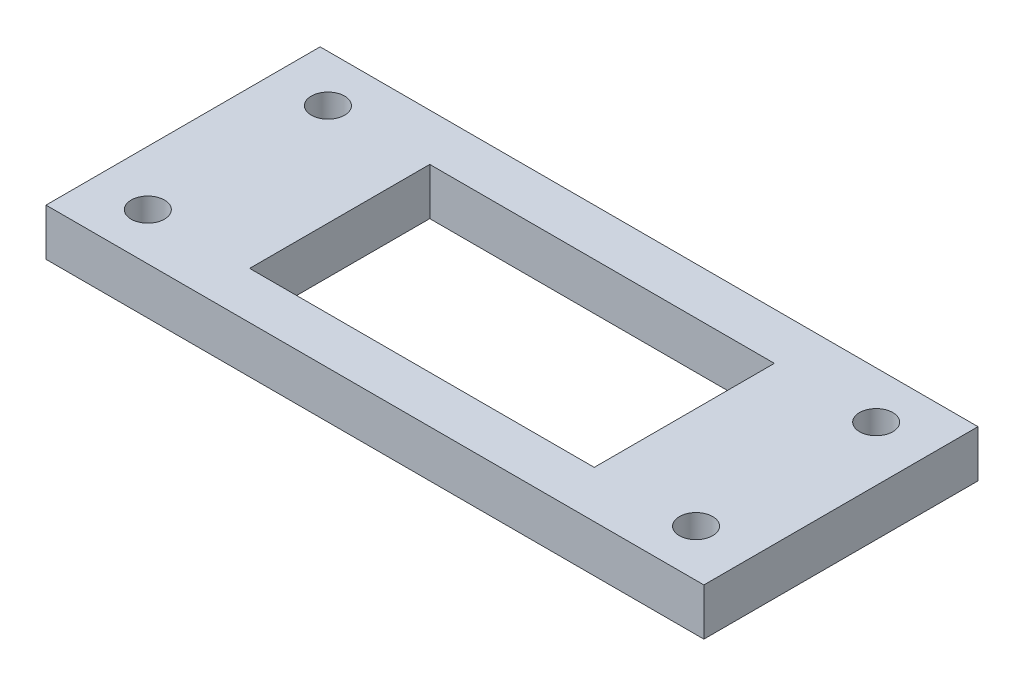
ISO-10303-21;
HEADER;
FILE_DESCRIPTION(('STEP AP214'),'2;1');
FILE_NAME('part.step','',(''),(''),'','','');
FILE_SCHEMA(('AUTOMOTIVE_DESIGN { 1 0 10303 214 1 1 1 1 }'));
ENDSEC;
DATA;
#1=APPLICATION_CONTEXT('core data for automotive mechanical design processes');
#2=APPLICATION_PROTOCOL_DEFINITION('international standard','automotive_design',2000,#1);
#3=PRODUCT_CONTEXT('',#1,'mechanical');
#4=PRODUCT('Part','Part','',(#3));
#5=PRODUCT_RELATED_PRODUCT_CATEGORY('part','',(#4));
#6=PRODUCT_DEFINITION_FORMATION('','',#4);
#7=PRODUCT_DEFINITION_CONTEXT('part definition',#1,'design');
#8=PRODUCT_DEFINITION('design','',#6,#7);
#9=PRODUCT_DEFINITION_SHAPE('','',#8);
#10=(LENGTH_UNIT() NAMED_UNIT(*) SI_UNIT(.MILLI.,.METRE.));
#11=(NAMED_UNIT(*) PLANE_ANGLE_UNIT() SI_UNIT($,.RADIAN.));
#12=(NAMED_UNIT(*) SI_UNIT($,.STERADIAN.) SOLID_ANGLE_UNIT());
#13=UNCERTAINTY_MEASURE_WITH_UNIT(LENGTH_MEASURE(1.E-05),#10,'distance_accuracy_value','');
#14=(GEOMETRIC_REPRESENTATION_CONTEXT(3) GLOBAL_UNCERTAINTY_ASSIGNED_CONTEXT((#13)) GLOBAL_UNIT_ASSIGNED_CONTEXT((#10,
#11,#12)) REPRESENTATION_CONTEXT('',''));
#15=CARTESIAN_POINT('',(0.,0.,0.));
#16=DIRECTION('',(0.,0.,1.));
#17=DIRECTION('',(1.,0.,0.));
#18=AXIS2_PLACEMENT_3D('',#15,#16,#17);
#19=CARTESIAN_POINT('',(0.,12.,0.));
#20=DIRECTION('',(0.,-1.,0.));
#21=DIRECTION('',(0.,0.,-1.));
#22=AXIS2_PLACEMENT_3D('',#19,#20,#21);
#23=PLANE('',#22);
#24=DIRECTION('',(0.,0.,1.));
#25=VECTOR('',#24,1.);
#26=CARTESIAN_POINT('',(-84.,12.,35.));
#27=LINE('',#26,#25);
#28=CARTESIAN_POINT('',(-84.,12.,-35.));
#29=VERTEX_POINT('',#28);
#30=CARTESIAN_POINT('',(-84.,12.,35.));
#31=VERTEX_POINT('',#30);
#32=EDGE_CURVE('E142',#29,#31,#27,.T.);
#33=ORIENTED_EDGE('',*,*,#32,.T.);
#34=DIRECTION('',(1.,0.,0.));
#35=VECTOR('',#34,1.);
#36=CARTESIAN_POINT('',(-84.,12.,35.));
#37=LINE('',#36,#35);
#38=CARTESIAN_POINT('',(84.,12.,35.));
#39=VERTEX_POINT('',#38);
#40=EDGE_CURVE('E147',#31,#39,#37,.T.);
#41=ORIENTED_EDGE('',*,*,#40,.T.);
#42=DIRECTION('',(0.,0.,-1.));
#43=VECTOR('',#42,1.);
#44=CARTESIAN_POINT('',(84.,12.,35.));
#45=LINE('',#44,#43);
#46=CARTESIAN_POINT('',(84.,12.,-35.));
#47=VERTEX_POINT('',#46);
#48=EDGE_CURVE('E146',#39,#47,#45,.T.);
#49=ORIENTED_EDGE('',*,*,#48,.T.);
#50=DIRECTION('',(-1.,0.,0.));
#51=VECTOR('',#50,1.);
#52=CARTESIAN_POINT('',(-84.,12.,-35.));
#53=LINE('',#52,#51);
#54=EDGE_CURVE('E151',#47,#29,#53,.T.);
#55=ORIENTED_EDGE('',*,*,#54,.T.);
#56=EDGE_LOOP('',(#33,#41,#49,#55));
#57=FACE_BOUND('',#56,.T.);
#58=DIRECTION('',(0.,0.,1.));
#59=VECTOR('',#58,1.);
#60=CARTESIAN_POINT('',(-44.,12.,23.));
#61=LINE('',#60,#59);
#62=CARTESIAN_POINT('',(-44.,12.,-23.));
#63=VERTEX_POINT('',#62);
#64=CARTESIAN_POINT('',(-44.,12.,23.));
#65=VERTEX_POINT('',#64);
#66=EDGE_CURVE('E101',#63,#65,#61,.T.);
#67=ORIENTED_EDGE('',*,*,#66,.F.);
#68=DIRECTION('',(-1.,0.,0.));
#69=VECTOR('',#68,1.);
#70=CARTESIAN_POINT('',(-44.,12.,-23.));
#71=LINE('',#70,#69);
#72=CARTESIAN_POINT('',(44.,12.,-23.));
#73=VERTEX_POINT('',#72);
#74=EDGE_CURVE('E130',#73,#63,#71,.T.);
#75=ORIENTED_EDGE('',*,*,#74,.F.);
#76=DIRECTION('',(0.,0.,-1.));
#77=VECTOR('',#76,1.);
#78=CARTESIAN_POINT('',(44.,12.,23.));
#79=LINE('',#78,#77);
#80=CARTESIAN_POINT('',(44.,12.,23.));
#81=VERTEX_POINT('',#80);
#82=EDGE_CURVE('E124',#81,#73,#79,.T.);
#83=ORIENTED_EDGE('',*,*,#82,.F.);
#84=DIRECTION('',(1.,0.,0.));
#85=VECTOR('',#84,1.);
#86=CARTESIAN_POINT('',(-44.,12.,23.));
#87=LINE('',#86,#85);
#88=EDGE_CURVE('E115',#65,#81,#87,.T.);
#89=ORIENTED_EDGE('',*,*,#88,.F.);
#90=EDGE_LOOP('',(#67,#75,#83,#89));
#91=FACE_BOUND('',#90,.T.);
#92=CARTESIAN_POINT('',(-70.,12.,23.));
#93=DIRECTION('',(0.,1.,0.));
#94=DIRECTION('',(0.,0.,1.));
#95=AXIS2_PLACEMENT_3D('',#92,#93,#94);
#96=CIRCLE('',#95,4.25);
#97=CARTESIAN_POINT('',(-70.,12.,27.25));
#98=VERTEX_POINT('',#97);
#99=EDGE_CURVE('E133',#98,#98,#96,.T.);
#100=ORIENTED_EDGE('',*,*,#99,.F.);
#101=EDGE_LOOP('',(#100));
#102=FACE_BOUND('',#101,.T.);
#103=CARTESIAN_POINT('',(70.,12.,23.));
#104=DIRECTION('',(0.,1.,0.));
#105=DIRECTION('',(0.,0.,1.));
#106=AXIS2_PLACEMENT_3D('',#103,#104,#105);
#107=CIRCLE('',#106,4.25);
#108=CARTESIAN_POINT('',(70.,12.,27.25));
#109=VERTEX_POINT('',#108);
#110=EDGE_CURVE('E255',#109,#109,#107,.T.);
#111=ORIENTED_EDGE('',*,*,#110,.F.);
#112=EDGE_LOOP('',(#111));
#113=FACE_BOUND('',#112,.T.);
#114=CARTESIAN_POINT('',(-70.,12.,-23.));
#115=DIRECTION('',(0.,1.,0.));
#116=DIRECTION('',(0.,0.,1.));
#117=AXIS2_PLACEMENT_3D('',#114,#115,#116);
#118=CIRCLE('',#117,4.25);
#119=CARTESIAN_POINT('',(-70.,12.,-18.75));
#120=VERTEX_POINT('',#119);
#121=EDGE_CURVE('E249',#120,#120,#118,.T.);
#122=ORIENTED_EDGE('',*,*,#121,.F.);
#123=EDGE_LOOP('',(#122));
#124=FACE_BOUND('',#123,.T.);
#125=CARTESIAN_POINT('',(70.,12.,-23.));
#126=DIRECTION('',(0.,1.,0.));
#127=DIRECTION('',(0.,0.,1.));
#128=AXIS2_PLACEMENT_3D('',#125,#126,#127);
#129=CIRCLE('',#128,4.25);
#130=CARTESIAN_POINT('',(70.,12.,-18.75));
#131=VERTEX_POINT('',#130);
#132=EDGE_CURVE('E238',#131,#131,#129,.T.);
#133=ORIENTED_EDGE('',*,*,#132,.F.);
#134=EDGE_LOOP('',(#133));
#135=FACE_BOUND('',#134,.T.);
#136=ADVANCED_FACE('F39',(#57,#91,#102,#113,#124,#135),#23,.F.);
#137=CARTESIAN_POINT('',(0.,0.,0.));
#138=DIRECTION('',(0.,-1.,0.));
#139=DIRECTION('',(0.,0.,-1.));
#140=AXIS2_PLACEMENT_3D('',#137,#138,#139);
#141=PLANE('',#140);
#142=CARTESIAN_POINT('',(-70.,0.,-23.));
#143=DIRECTION('',(0.,1.,0.));
#144=DIRECTION('',(0.,0.,1.));
#145=AXIS2_PLACEMENT_3D('',#142,#143,#144);
#146=CIRCLE('',#145,4.25);
#147=CARTESIAN_POINT('',(-70.,0.,-18.75));
#148=VERTEX_POINT('',#147);
#149=EDGE_CURVE('E247',#148,#148,#146,.T.);
#150=ORIENTED_EDGE('',*,*,#149,.T.);
#151=EDGE_LOOP('',(#150));
#152=FACE_BOUND('',#151,.T.);
#153=CARTESIAN_POINT('',(-70.,0.,23.));
#154=DIRECTION('',(0.,1.,0.));
#155=DIRECTION('',(0.,0.,1.));
#156=AXIS2_PLACEMENT_3D('',#153,#154,#155);
#157=CIRCLE('',#156,4.25);
#158=CARTESIAN_POINT('',(-70.,0.,27.25));
#159=VERTEX_POINT('',#158);
#160=EDGE_CURVE('E256',#159,#159,#157,.T.);
#161=ORIENTED_EDGE('',*,*,#160,.T.);
#162=EDGE_LOOP('',(#161));
#163=FACE_BOUND('',#162,.T.);
#164=DIRECTION('',(0.,0.,1.));
#165=VECTOR('',#164,1.);
#166=CARTESIAN_POINT('',(-84.,0.,35.));
#167=LINE('',#166,#165);
#168=CARTESIAN_POINT('',(-84.,0.,-35.));
#169=VERTEX_POINT('',#168);
#170=CARTESIAN_POINT('',(-84.,0.,35.));
#171=VERTEX_POINT('',#170);
#172=EDGE_CURVE('E120',#169,#171,#167,.T.);
#173=ORIENTED_EDGE('',*,*,#172,.F.);
#174=DIRECTION('',(-1.,0.,0.));
#175=VECTOR('',#174,1.);
#176=CARTESIAN_POINT('',(-84.,0.,-35.));
#177=LINE('',#176,#175);
#178=CARTESIAN_POINT('',(84.,0.,-35.));
#179=VERTEX_POINT('',#178);
#180=EDGE_CURVE('E150',#179,#169,#177,.T.);
#181=ORIENTED_EDGE('',*,*,#180,.F.);
#182=DIRECTION('',(0.,0.,-1.));
#183=VECTOR('',#182,1.);
#184=CARTESIAN_POINT('',(84.,0.,35.));
#185=LINE('',#184,#183);
#186=CARTESIAN_POINT('',(84.,0.,35.));
#187=VERTEX_POINT('',#186);
#188=EDGE_CURVE('E156',#187,#179,#185,.T.);
#189=ORIENTED_EDGE('',*,*,#188,.F.);
#190=DIRECTION('',(1.,0.,0.));
#191=VECTOR('',#190,1.);
#192=CARTESIAN_POINT('',(-84.,0.,35.));
#193=LINE('',#192,#191);
#194=EDGE_CURVE('E157',#171,#187,#193,.T.);
#195=ORIENTED_EDGE('',*,*,#194,.F.);
#196=EDGE_LOOP('',(#173,#181,#189,#195));
#197=FACE_BOUND('',#196,.T.);
#198=DIRECTION('',(-1.,0.,0.));
#199=VECTOR('',#198,1.);
#200=CARTESIAN_POINT('',(-44.,0.,-23.));
#201=LINE('',#200,#199);
#202=CARTESIAN_POINT('',(44.,0.,-23.));
#203=VERTEX_POINT('',#202);
#204=CARTESIAN_POINT('',(-44.,0.,-23.));
#205=VERTEX_POINT('',#204);
#206=EDGE_CURVE('E111',#203,#205,#201,.T.);
#207=ORIENTED_EDGE('',*,*,#206,.T.);
#208=DIRECTION('',(0.,0.,1.));
#209=VECTOR('',#208,1.);
#210=CARTESIAN_POINT('',(-44.,0.,23.));
#211=LINE('',#210,#209);
#212=CARTESIAN_POINT('',(-44.,0.,23.));
#213=VERTEX_POINT('',#212);
#214=EDGE_CURVE('E62',#205,#213,#211,.T.);
#215=ORIENTED_EDGE('',*,*,#214,.T.);
#216=DIRECTION('',(1.,0.,0.));
#217=VECTOR('',#216,1.);
#218=CARTESIAN_POINT('',(-44.,0.,23.));
#219=LINE('',#218,#217);
#220=CARTESIAN_POINT('',(44.,0.,23.));
#221=VERTEX_POINT('',#220);
#222=EDGE_CURVE('E118',#213,#221,#219,.T.);
#223=ORIENTED_EDGE('',*,*,#222,.T.);
#224=DIRECTION('',(0.,0.,-1.));
#225=VECTOR('',#224,1.);
#226=CARTESIAN_POINT('',(44.,0.,23.));
#227=LINE('',#226,#225);
#228=EDGE_CURVE('E134',#221,#203,#227,.T.);
#229=ORIENTED_EDGE('',*,*,#228,.T.);
#230=EDGE_LOOP('',(#207,#215,#223,#229));
#231=FACE_BOUND('',#230,.T.);
#232=CARTESIAN_POINT('',(70.,0.,23.));
#233=DIRECTION('',(0.,1.,0.));
#234=DIRECTION('',(0.,0.,1.));
#235=AXIS2_PLACEMENT_3D('',#232,#233,#234);
#236=CIRCLE('',#235,4.25);
#237=CARTESIAN_POINT('',(70.,0.,27.25));
#238=VERTEX_POINT('',#237);
#239=EDGE_CURVE('E252',#238,#238,#236,.T.);
#240=ORIENTED_EDGE('',*,*,#239,.T.);
#241=EDGE_LOOP('',(#240));
#242=FACE_BOUND('',#241,.T.);
#243=CARTESIAN_POINT('',(70.,0.,-23.));
#244=DIRECTION('',(0.,1.,0.));
#245=DIRECTION('',(0.,0.,1.));
#246=AXIS2_PLACEMENT_3D('',#243,#244,#245);
#247=CIRCLE('',#246,4.25);
#248=CARTESIAN_POINT('',(70.,0.,-18.75));
#249=VERTEX_POINT('',#248);
#250=EDGE_CURVE('E244',#249,#249,#247,.T.);
#251=ORIENTED_EDGE('',*,*,#250,.T.);
#252=EDGE_LOOP('',(#251));
#253=FACE_BOUND('',#252,.T.);
#254=ADVANCED_FACE('F176',(#152,#163,#197,#231,#242,#253),#141,.T.);
#255=CARTESIAN_POINT('',(-84.,12.,35.));
#256=DIRECTION('',(1.,0.,0.));
#257=DIRECTION('',(0.,0.,-1.));
#258=AXIS2_PLACEMENT_3D('',#255,#256,#257);
#259=PLANE('',#258);
#260=ORIENTED_EDGE('',*,*,#172,.T.);
#261=DIRECTION('',(0.,-1.,0.));
#262=VECTOR('',#261,1.);
#263=CARTESIAN_POINT('',(-84.,12.,35.));
#264=LINE('',#263,#262);
#265=EDGE_CURVE('E11',#31,#171,#264,.T.);
#266=ORIENTED_EDGE('',*,*,#265,.F.);
#267=ORIENTED_EDGE('',*,*,#32,.F.);
#268=DIRECTION('',(0.,-1.,0.));
#269=VECTOR('',#268,1.);
#270=CARTESIAN_POINT('',(-84.,12.,-35.));
#271=LINE('',#270,#269);
#272=EDGE_CURVE('E154',#29,#169,#271,.T.);
#273=ORIENTED_EDGE('',*,*,#272,.T.);
#274=EDGE_LOOP('',(#260,#266,#267,#273));
#275=FACE_BOUND('',#274,.T.);
#276=ADVANCED_FACE('F41',(#275),#259,.F.);
#277=CARTESIAN_POINT('',(-84.,12.,35.));
#278=DIRECTION('',(0.,0.,-1.));
#279=DIRECTION('',(-1.,0.,0.));
#280=AXIS2_PLACEMENT_3D('',#277,#278,#279);
#281=PLANE('',#280);
#282=ORIENTED_EDGE('',*,*,#194,.T.);
#283=DIRECTION('',(0.,-1.,0.));
#284=VECTOR('',#283,1.);
#285=CARTESIAN_POINT('',(84.,12.,35.));
#286=LINE('',#285,#284);
#287=EDGE_CURVE('E50',#39,#187,#286,.T.);
#288=ORIENTED_EDGE('',*,*,#287,.F.);
#289=ORIENTED_EDGE('',*,*,#40,.F.);
#290=ORIENTED_EDGE('',*,*,#265,.T.);
#291=EDGE_LOOP('',(#282,#288,#289,#290));
#292=FACE_BOUND('',#291,.T.);
#293=ADVANCED_FACE('F186',(#292),#281,.F.);
#294=CARTESIAN_POINT('',(84.,12.,35.));
#295=DIRECTION('',(-1.,0.,0.));
#296=DIRECTION('',(0.,0.,1.));
#297=AXIS2_PLACEMENT_3D('',#294,#295,#296);
#298=PLANE('',#297);
#299=ORIENTED_EDGE('',*,*,#188,.T.);
#300=DIRECTION('',(0.,-1.,0.));
#301=VECTOR('',#300,1.);
#302=CARTESIAN_POINT('',(84.,12.,-35.));
#303=LINE('',#302,#301);
#304=EDGE_CURVE('E164',#47,#179,#303,.T.);
#305=ORIENTED_EDGE('',*,*,#304,.F.);
#306=ORIENTED_EDGE('',*,*,#48,.F.);
#307=ORIENTED_EDGE('',*,*,#287,.T.);
#308=EDGE_LOOP('',(#299,#305,#306,#307));
#309=FACE_BOUND('',#308,.T.);
#310=ADVANCED_FACE('F169',(#309),#298,.F.);
#311=CARTESIAN_POINT('',(-84.,12.,-35.));
#312=DIRECTION('',(0.,0.,1.));
#313=DIRECTION('',(1.,0.,0.));
#314=AXIS2_PLACEMENT_3D('',#311,#312,#313);
#315=PLANE('',#314);
#316=ORIENTED_EDGE('',*,*,#180,.T.);
#317=ORIENTED_EDGE('',*,*,#272,.F.);
#318=ORIENTED_EDGE('',*,*,#54,.F.);
#319=ORIENTED_EDGE('',*,*,#304,.T.);
#320=EDGE_LOOP('',(#316,#317,#318,#319));
#321=FACE_BOUND('',#320,.T.);
#322=ADVANCED_FACE('F179',(#321),#315,.F.);
#323=CARTESIAN_POINT('',(-44.,12.,23.));
#324=DIRECTION('',(1.,0.,0.));
#325=DIRECTION('',(0.,0.,-1.));
#326=AXIS2_PLACEMENT_3D('',#323,#324,#325);
#327=PLANE('',#326);
#328=ORIENTED_EDGE('',*,*,#214,.F.);
#329=DIRECTION('',(0.,-1.,0.));
#330=VECTOR('',#329,1.);
#331=CARTESIAN_POINT('',(-44.,12.,-23.));
#332=LINE('',#331,#330);
#333=EDGE_CURVE('E109',#63,#205,#332,.T.);
#334=ORIENTED_EDGE('',*,*,#333,.F.);
#335=ORIENTED_EDGE('',*,*,#66,.T.);
#336=DIRECTION('',(0.,-1.,0.));
#337=VECTOR('',#336,1.);
#338=CARTESIAN_POINT('',(-44.,12.,23.));
#339=LINE('',#338,#337);
#340=EDGE_CURVE('E107',#65,#213,#339,.T.);
#341=ORIENTED_EDGE('',*,*,#340,.T.);
#342=EDGE_LOOP('',(#328,#334,#335,#341));
#343=FACE_BOUND('',#342,.T.);
#344=ADVANCED_FACE('F106',(#343),#327,.T.);
#345=CARTESIAN_POINT('',(-44.,12.,23.));
#346=DIRECTION('',(0.,0.,-1.));
#347=DIRECTION('',(-1.,0.,0.));
#348=AXIS2_PLACEMENT_3D('',#345,#346,#347);
#349=PLANE('',#348);
#350=ORIENTED_EDGE('',*,*,#222,.F.);
#351=ORIENTED_EDGE('',*,*,#340,.F.);
#352=ORIENTED_EDGE('',*,*,#88,.T.);
#353=DIRECTION('',(0.,-1.,0.));
#354=VECTOR('',#353,1.);
#355=CARTESIAN_POINT('',(44.,12.,23.));
#356=LINE('',#355,#354);
#357=EDGE_CURVE('E123',#81,#221,#356,.T.);
#358=ORIENTED_EDGE('',*,*,#357,.T.);
#359=EDGE_LOOP('',(#350,#351,#352,#358));
#360=FACE_BOUND('',#359,.T.);
#361=ADVANCED_FACE('F116',(#360),#349,.T.);
#362=CARTESIAN_POINT('',(44.,12.,23.));
#363=DIRECTION('',(-1.,0.,0.));
#364=DIRECTION('',(0.,0.,1.));
#365=AXIS2_PLACEMENT_3D('',#362,#363,#364);
#366=PLANE('',#365);
#367=ORIENTED_EDGE('',*,*,#228,.F.);
#368=ORIENTED_EDGE('',*,*,#357,.F.);
#369=ORIENTED_EDGE('',*,*,#82,.T.);
#370=DIRECTION('',(0.,-1.,0.));
#371=VECTOR('',#370,1.);
#372=CARTESIAN_POINT('',(44.,12.,-23.));
#373=LINE('',#372,#371);
#374=EDGE_CURVE('E53',#73,#203,#373,.T.);
#375=ORIENTED_EDGE('',*,*,#374,.T.);
#376=EDGE_LOOP('',(#367,#368,#369,#375));
#377=FACE_BOUND('',#376,.T.);
#378=ADVANCED_FACE('F210',(#377),#366,.T.);
#379=CARTESIAN_POINT('',(-44.,12.,-23.));
#380=DIRECTION('',(0.,0.,1.));
#381=DIRECTION('',(1.,0.,0.));
#382=AXIS2_PLACEMENT_3D('',#379,#380,#381);
#383=PLANE('',#382);
#384=ORIENTED_EDGE('',*,*,#206,.F.);
#385=ORIENTED_EDGE('',*,*,#374,.F.);
#386=ORIENTED_EDGE('',*,*,#74,.T.);
#387=ORIENTED_EDGE('',*,*,#333,.T.);
#388=EDGE_LOOP('',(#384,#385,#386,#387));
#389=FACE_BOUND('',#388,.T.);
#390=ADVANCED_FACE('F215',(#389),#383,.T.);
#391=CARTESIAN_POINT('',(-70.,12.,23.));
#392=DIRECTION('',(0.,-1.,0.));
#393=DIRECTION('',(0.,0.,-1.));
#394=AXIS2_PLACEMENT_3D('',#391,#392,#393);
#395=CYLINDRICAL_SURFACE('',#394,4.25);
#396=ORIENTED_EDGE('',*,*,#99,.T.);
#397=EDGE_LOOP('',(#396));
#398=FACE_BOUND('',#397,.T.);
#399=ORIENTED_EDGE('',*,*,#160,.F.);
#400=EDGE_LOOP('',(#399));
#401=FACE_BOUND('',#400,.T.);
#402=ADVANCED_FACE('F217',(#398,#401),#395,.F.);
#403=CARTESIAN_POINT('',(70.,12.,23.));
#404=DIRECTION('',(0.,-1.,0.));
#405=DIRECTION('',(0.,0.,-1.));
#406=AXIS2_PLACEMENT_3D('',#403,#404,#405);
#407=CYLINDRICAL_SURFACE('',#406,4.25);
#408=ORIENTED_EDGE('',*,*,#110,.T.);
#409=EDGE_LOOP('',(#408));
#410=FACE_BOUND('',#409,.T.);
#411=ORIENTED_EDGE('',*,*,#239,.F.);
#412=EDGE_LOOP('',(#411));
#413=FACE_BOUND('',#412,.T.);
#414=ADVANCED_FACE('F223',(#410,#413),#407,.F.);
#415=CARTESIAN_POINT('',(-70.,12.,-23.));
#416=DIRECTION('',(0.,-1.,0.));
#417=DIRECTION('',(0.,0.,-1.));
#418=AXIS2_PLACEMENT_3D('',#415,#416,#417);
#419=CYLINDRICAL_SURFACE('',#418,4.25);
#420=ORIENTED_EDGE('',*,*,#121,.T.);
#421=EDGE_LOOP('',(#420));
#422=FACE_BOUND('',#421,.T.);
#423=ORIENTED_EDGE('',*,*,#149,.F.);
#424=EDGE_LOOP('',(#423));
#425=FACE_BOUND('',#424,.T.);
#426=ADVANCED_FACE('F230',(#422,#425),#419,.F.);
#427=CARTESIAN_POINT('',(70.,12.,-23.));
#428=DIRECTION('',(0.,-1.,0.));
#429=DIRECTION('',(0.,0.,-1.));
#430=AXIS2_PLACEMENT_3D('',#427,#428,#429);
#431=CYLINDRICAL_SURFACE('',#430,4.25);
#432=ORIENTED_EDGE('',*,*,#132,.T.);
#433=EDGE_LOOP('',(#432));
#434=FACE_BOUND('',#433,.T.);
#435=ORIENTED_EDGE('',*,*,#250,.F.);
#436=EDGE_LOOP('',(#435));
#437=FACE_BOUND('',#436,.T.);
#438=ADVANCED_FACE('F231',(#434,#437),#431,.F.);
#439=CLOSED_SHELL('',(#136,#254,#276,#293,#310,#322,#344,#361,#378,#390,#402,#414,#426,#438));
#440=MANIFOLD_SOLID_BREP('B2',#439);
#441=ADVANCED_BREP_SHAPE_REPRESENTATION('',(#18,#440),#14);
#442=SHAPE_DEFINITION_REPRESENTATION(#9,#441);
ENDSEC;
END-ISO-10303-21;
